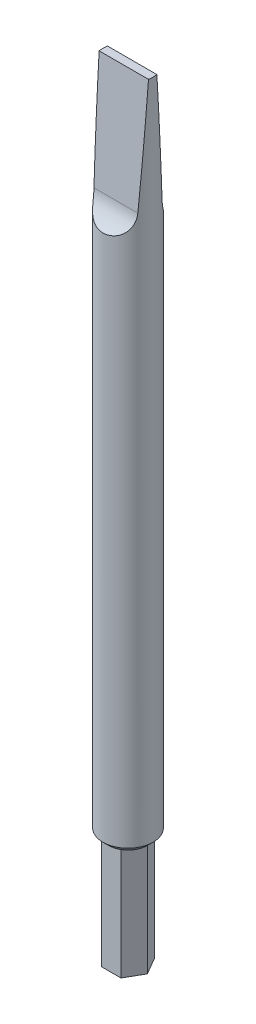
ISO-10303-21;
HEADER;
FILE_DESCRIPTION(('STEP AP214'),'2;1');
FILE_NAME('part.step','',(''),(''),'','','');
FILE_SCHEMA(('AUTOMOTIVE_DESIGN { 1 0 10303 214 1 1 1 1 }'));
ENDSEC;
DATA;
#1=APPLICATION_CONTEXT('core data for automotive mechanical design processes');
#2=APPLICATION_PROTOCOL_DEFINITION('international standard','automotive_design',2000,#1);
#3=PRODUCT_CONTEXT('',#1,'mechanical');
#4=PRODUCT('Part','Part','',(#3));
#5=PRODUCT_RELATED_PRODUCT_CATEGORY('part','',(#4));
#6=PRODUCT_DEFINITION_FORMATION('','',#4);
#7=PRODUCT_DEFINITION_CONTEXT('part definition',#1,'design');
#8=PRODUCT_DEFINITION('design','',#6,#7);
#9=PRODUCT_DEFINITION_SHAPE('','',#8);
#10=(LENGTH_UNIT() NAMED_UNIT(*) SI_UNIT(.MILLI.,.METRE.));
#11=(NAMED_UNIT(*) PLANE_ANGLE_UNIT() SI_UNIT($,.RADIAN.));
#12=(NAMED_UNIT(*) SI_UNIT($,.STERADIAN.) SOLID_ANGLE_UNIT());
#13=UNCERTAINTY_MEASURE_WITH_UNIT(LENGTH_MEASURE(1.E-05),#10,'distance_accuracy_value','');
#14=(GEOMETRIC_REPRESENTATION_CONTEXT(3) GLOBAL_UNCERTAINTY_ASSIGNED_CONTEXT((#13)) GLOBAL_UNIT_ASSIGNED_CONTEXT((#10,
#11,#12)) REPRESENTATION_CONTEXT('',''));
#15=CARTESIAN_POINT('',(0.,0.,0.));
#16=DIRECTION('',(0.,0.,1.));
#17=DIRECTION('',(1.,0.,0.));
#18=AXIS2_PLACEMENT_3D('',#15,#16,#17);
#19=CARTESIAN_POINT('',(0.,140.,0.));
#20=DIRECTION('',(0.,-1.,0.));
#21=DIRECTION('',(0.,0.,-1.));
#22=AXIS2_PLACEMENT_3D('',#19,#20,#21);
#23=CYLINDRICAL_SURFACE('',#22,4.5);
#24=CARTESIAN_POINT('',(0.,21.,0.));
#25=DIRECTION('',(0.,1.,0.));
#26=DIRECTION('',(0.,0.,1.));
#27=AXIS2_PLACEMENT_3D('',#24,#25,#26);
#28=CIRCLE('',#27,4.5);
#29=CARTESIAN_POINT('',(0.,21.,4.5));
#30=VERTEX_POINT('',#29);
#31=EDGE_CURVE('E120',#30,#30,#28,.T.);
#32=ORIENTED_EDGE('',*,*,#31,.T.);
#33=EDGE_LOOP('',(#32));
#34=FACE_BOUND('',#33,.T.);
#35=CARTESIAN_POINT('',(0.,150.725499692534,0.));
#36=DIRECTION('',(0.,-0.0697564737441255,0.997564050259824));
#37=DIRECTION('',(0.,-0.997564050259824,-0.0697564737441255));
#38=AXIS2_PLACEMENT_3D('',#35,#36,#37);
#39=ELLIPSE('',#38,64.5101416179164,4.5);
#40=CARTESIAN_POINT('',(-4.43705983732471,140.,-0.75));
#41=VERTEX_POINT('',#40);
#42=CARTESIAN_POINT('',(-3.94060843870063,119.651217631279,-2.17292547797695));
#43=VERTEX_POINT('',#42);
#44=EDGE_CURVE('E117',#41,#43,#39,.T.);
#45=ORIENTED_EDGE('',*,*,#44,.T.);
#46=CARTESIAN_POINT('',(-3.94060843870063,119.651217631279,-2.17292547797695));
#47=CARTESIAN_POINT('',(-3.93613453836127,119.535820622681,-2.18097697918259));
#48=CARTESIAN_POINT('',(-3.92947094474121,119.420781980209,-2.19306262577348));
#49=CARTESIAN_POINT('',(-3.91143990386196,119.192142075211,-2.22509503569858));
#50=CARTESIAN_POINT('',(-3.90007100119166,119.078541268641,-2.24504423123616));
#51=CARTESIAN_POINT('',(-3.87225058788964,118.853110956475,-2.29268834893347));
#52=CARTESIAN_POINT('',(-3.85577852224869,118.741290572735,-2.32041455254768));
#53=CARTESIAN_POINT('',(-3.81728624165493,118.520713395312,-2.38320927692897));
#54=CARTESIAN_POINT('',(-3.7952665438402,118.411956317124,-2.41827711327371));
#55=CARTESIAN_POINT('',(-3.74503067779342,118.197992726652,-2.49536896839162));
#56=CARTESIAN_POINT('',(-3.71679509883591,118.092798554982,-2.53741467384939));
#57=CARTESIAN_POINT('',(-3.65353870193093,117.887206844789,-2.62767774279539));
#58=CARTESIAN_POINT('',(-3.61851845768965,117.786808901595,-2.6758945843401));
#59=CARTESIAN_POINT('',(-3.54114938762096,117.5919056934,-2.77746734917336));
#60=CARTESIAN_POINT('',(-3.49881744140523,117.497387523424,-2.8308113130091));
#61=CARTESIAN_POINT('',(-3.40621740877894,117.31485041299,-2.94157932893592));
#62=CARTESIAN_POINT('',(-3.35595018710472,117.226830765896,-2.99900293607863));
#63=CARTESIAN_POINT('',(-3.2509131085579,117.06399317642,-3.11241176095055));
#64=CARTESIAN_POINT('',(-3.19670952020653,116.988682062981,-3.16821355425757));
#65=CARTESIAN_POINT('',(-3.08094814297472,116.84482757073,-3.28089601782652));
#66=CARTESIAN_POINT('',(-3.01939113283397,116.776283476681,-3.33777657330996));
#67=CARTESIAN_POINT('',(-2.88897355401037,116.646304005054,-3.45127540230262));
#68=CARTESIAN_POINT('',(-2.82011348473832,116.584868141988,-3.50789369347048));
#69=CARTESIAN_POINT('',(-2.67534804580783,116.469261101259,-3.61951134401522));
#70=CARTESIAN_POINT('',(-2.59944311297892,116.415089473671,-3.67451080349254));
#71=CARTESIAN_POINT('',(-2.44854074393229,116.31876356579,-3.77652535953582));
#72=CARTESIAN_POINT('',(-2.37413558447831,116.275957387855,-3.82380378625174));
#73=CARTESIAN_POINT('',(-2.22035176089097,116.196122204785,-3.91510350311531));
#74=CARTESIAN_POINT('',(-2.1409714916143,116.159095077761,-3.95912373196058));
#75=CARTESIAN_POINT('',(-1.97777084438874,116.090604730084,-4.04312355064205));
#76=CARTESIAN_POINT('',(-1.89394932917378,116.059142943579,-4.08310209783241));
#77=CARTESIAN_POINT('',(-1.72243379944664,116.001505778205,-4.15836458405134));
#78=CARTESIAN_POINT('',(-1.63473840777442,115.975332298059,-4.19364683536832));
#79=CARTESIAN_POINT('',(-1.45498290195123,115.927687019373,-4.25937769280765));
#80=CARTESIAN_POINT('',(-1.36288173901448,115.906278557151,-4.28975985781964));
#81=CARTESIAN_POINT('',(-1.1759495804635,115.868275534781,-4.34472539225634));
#82=CARTESIAN_POINT('',(-1.08111733362925,115.85168322095,-4.36930605478777));
#83=CARTESIAN_POINT('',(-0.889589599589853,115.82308487023,-4.41228344912634));
#84=CARTESIAN_POINT('',(-0.79289819616783,115.811069771572,-4.43069239067199));
#85=CARTESIAN_POINT('',(-0.598088772234085,115.791365663627,-4.46116654062827));
#86=CARTESIAN_POINT('',(-0.499970875992385,115.783676279791,-4.47323229826743));
#87=CARTESIAN_POINT('',(-0.334793464227262,115.774289745482,-4.48802810345971));
#88=CARTESIAN_POINT('',(-0.267948323013006,115.771459023129,-4.49251523740662));
#89=CARTESIAN_POINT('',(-0.13407114126273,115.767687692857,-4.49850140980018));
#90=CARTESIAN_POINT('',(-0.0670390990430205,115.766747102021,-4.50000042124079));
#91=CARTESIAN_POINT('',(0.103899728165749,115.766746479842,-4.4999993471451));
#92=CARTESIAN_POINT('',(0.207816406800852,115.769004812056,-4.49639706128998));
#93=CARTESIAN_POINT('',(0.414992715633222,115.778088182435,-4.48202756678654));
#94=CARTESIAN_POINT('',(0.518252019298791,115.784915334752,-4.47125704115421));
#95=CARTESIAN_POINT('',(0.72354459567443,115.803298078138,-4.44266135596965));
#96=CARTESIAN_POINT('',(0.825575538970318,115.814861528568,-4.42482447219796));
#97=CARTESIAN_POINT('',(1.02756052241239,115.842954372874,-4.38232527899109));
#98=CARTESIAN_POINT('',(1.12751361949297,115.859485971193,-4.35765994004909));
#99=CARTESIAN_POINT('',(1.32469006293437,115.897838871514,-4.30182602120851));
#100=CARTESIAN_POINT('',(1.42190987280691,115.919666703646,-4.27064941973946));
#101=CARTESIAN_POINT('',(1.61270615332902,115.968939005443,-4.2023137913944));
#102=CARTESIAN_POINT('',(1.70628435417008,115.996380768077,-4.16515764968153));
#103=CARTESIAN_POINT('',(1.88905676568278,116.057229964812,-4.0855103376416));
#104=CARTESIAN_POINT('',(1.97825380865808,116.090633478304,-4.0430226788836));
#105=CARTESIAN_POINT('',(2.15162802908161,116.163752699636,-3.9534813076382));
#106=CARTESIAN_POINT('',(2.23580544578817,116.203468106292,-3.90642781306074));
#107=CARTESIAN_POINT('',(2.39605028556675,116.288175405829,-3.81017251378525));
#108=CARTESIAN_POINT('',(2.47228585911362,116.332971722124,-3.76107850575399));
#109=CARTESIAN_POINT('',(2.61898270302838,116.428905771767,-3.66044320005788));
#110=CARTESIAN_POINT('',(2.68944197304487,116.480045686644,-3.60890106427653));
#111=CARTESIAN_POINT('',(2.82415599278799,116.588634634983,-3.50448332513091));
#112=CARTESIAN_POINT('',(2.88841415937435,116.646080156272,-3.45160847659475));
#113=CARTESIAN_POINT('',(3.01058224303269,116.767195132877,-3.34558516850439));
#114=CARTESIAN_POINT('',(3.06848981966071,116.830866866557,-3.29243661558388));
#115=CARTESIAN_POINT('',(3.17574329962985,116.961540598027,-3.18904171265143));
#116=CARTESIAN_POINT('',(3.22533513488353,117.02831565721,-3.13876304771544));
#117=CARTESIAN_POINT('',(3.31869480646398,117.167024542179,-3.03988341659307));
#118=CARTESIAN_POINT('',(3.36246057537569,117.238960185368,-2.99128305046797));
#119=CARTESIAN_POINT('',(3.44435200258204,117.387545271136,-2.89661152472469));
#120=CARTESIAN_POINT('',(3.48247761883404,117.464194748846,-2.8505403839614));
#121=CARTESIAN_POINT('',(3.5533922834407,117.621759266709,-2.76163697617394));
#122=CARTESIAN_POINT('',(3.58617934656772,117.702675878924,-2.71880591718233));
#123=CARTESIAN_POINT('',(3.64844684895386,117.872898609567,-2.63471555664882));
#124=CARTESIAN_POINT('',(3.67763825368493,117.962420683473,-2.59367954418584));
#125=CARTESIAN_POINT('',(3.73087847262744,118.145069383353,-2.51649461313893));
#126=CARTESIAN_POINT('',(3.75492510540121,118.238197518649,-2.48034776999426));
#127=CARTESIAN_POINT('',(3.79828256501097,118.427405808864,-2.41342928729884));
#128=CARTESIAN_POINT('',(3.8175946756726,118.523485155555,-2.38265619124115));
#129=CARTESIAN_POINT('',(3.85188091079617,118.718051853066,-2.32681768893628));
#130=CARTESIAN_POINT('',(3.86685449345663,118.816539502973,-2.30175299564602));
#131=CARTESIAN_POINT('',(3.89557075715267,119.036560045232,-2.25289241108845));
#132=CARTESIAN_POINT('',(3.90837111115832,119.158531278134,-2.23050520402001));
#133=CARTESIAN_POINT('',(3.92848003713233,119.403943849301,-2.19484953417759));
#134=CARTESIAN_POINT('',(3.935801859481,119.527380902223,-2.18155907668645));
#135=CARTESIAN_POINT('',(3.94060843870063,119.651217631279,-2.17292547797695));
#136=B_SPLINE_CURVE_WITH_KNOTS('',3,(#46,#47,#48,#49,#50,#51,#52,#53,#54,#55,#56,#57,#58,#59,
#60,#61,#62,#63,#64,#65,#66,#67,#68,#69,#70,#71,#72,#73,#74,#75,#76,#77,#78,#79,#80,#81,#82,#83,
#84,#85,#86,#87,#88,#89,#90,#91,#92,#93,#94,#95,#96,#97,#98,#99,#100,#101,#102,#103,#104,#105,
#106,#107,#108,#109,#110,#111,#112,#113,#114,#115,#116,#117,#118,#119,#120,#121,#122,#123,#124,
#125,#126,#127,#128,#129,#130,#131,#132,#133,#134,#135),.UNSPECIFIED.,.F.,.F.,(4,2,2,2,2,2,2,2,
2,2,2,2,2,2,2,2,2,2,2,2,2,2,2,2,2,2,2,2,2,2,2,2,2,2,2,2,2,2,2,2,2,2,2,2,4),(0.,
0.347213481850569,0.694534441545247,1.04327297331349,1.39197900846225,1.74178981927731,
2.0915710632544,2.44055534800831,2.78950162887225,3.11387755351365,3.43821915660431,
3.76253859427388,4.0868379353466,4.38048652057452,4.67423033967266,4.96804974448696,
5.26197445596483,5.55959931971795,5.85736277740991,6.15453363404642,6.45167875571976,
6.65275701811362,6.85383709780357,7.16547860130776,7.47726441210352,7.78956970663768,
8.10201378094383,8.41484506654002,8.72752585929502,9.0400017773417,9.35246278943322,
9.65548728912213,9.95861628768749,10.2615772943742,10.5646495816183,10.8558942484657,
11.1472419913091,11.4385919057976,11.7300499172571,12.0378731212137,12.3458265879224,
12.6536964565557,12.9616047558561,13.3351302308025,13.7077493504199),.UNSPECIFIED.);
#137=CARTESIAN_POINT('',(3.94060843870063,119.651217631279,-2.17292547797695));
#138=VERTEX_POINT('',#137);
#139=EDGE_CURVE('E12',#43,#138,#136,.T.);
#140=ORIENTED_EDGE('',*,*,#139,.T.);
#141=CARTESIAN_POINT('',(4.43705983732471,140.,-0.75));
#142=VERTEX_POINT('',#141);
#143=EDGE_CURVE('E82',#138,#142,#39,.T.);
#144=ORIENTED_EDGE('',*,*,#143,.T.);
#145=CARTESIAN_POINT('',(0.,140.,0.));
#146=DIRECTION('',(0.,1.,0.));
#147=DIRECTION('',(0.,0.,1.));
#148=AXIS2_PLACEMENT_3D('',#145,#146,#147);
#149=CIRCLE('',#148,4.5);
#150=CARTESIAN_POINT('',(4.43705983732471,140.,0.75));
#151=VERTEX_POINT('',#150);
#152=EDGE_CURVE('E114',#151,#142,#149,.T.);
#153=ORIENTED_EDGE('',*,*,#152,.F.);
#154=CARTESIAN_POINT('',(0.,150.725499692534,0.));
#155=DIRECTION('',(0.,-0.0697564737441255,-0.997564050259824));
#156=DIRECTION('',(0.,-0.997564050259824,0.0697564737441255));
#157=AXIS2_PLACEMENT_3D('',#154,#155,#156);
#158=ELLIPSE('',#157,64.5101416179164,4.5);
#159=CARTESIAN_POINT('',(3.94060843870063,119.651217631279,2.17292547797695));
#160=VERTEX_POINT('',#159);
#161=EDGE_CURVE('E101',#160,#151,#158,.F.);
#162=ORIENTED_EDGE('',*,*,#161,.F.);
#163=CARTESIAN_POINT('',(3.94060843870063,119.651217631279,2.17292547797695));
#164=CARTESIAN_POINT('',(3.93613453836127,119.535820622681,2.18097697918259));
#165=CARTESIAN_POINT('',(3.92947094474121,119.420781980209,2.19306262577348));
#166=CARTESIAN_POINT('',(3.91143990386196,119.192142075211,2.22509503569858));
#167=CARTESIAN_POINT('',(3.90007100119166,119.078541268641,2.24504423123616));
#168=CARTESIAN_POINT('',(3.87225058788964,118.853110956475,2.29268834893347));
#169=CARTESIAN_POINT('',(3.85577852224869,118.741290572735,2.32041455254768));
#170=CARTESIAN_POINT('',(3.81728624165493,118.520713395312,2.38320927692897));
#171=CARTESIAN_POINT('',(3.7952665438402,118.411956317124,2.41827711327371));
#172=CARTESIAN_POINT('',(3.74503067779342,118.197992726652,2.49536896839162));
#173=CARTESIAN_POINT('',(3.71679509883591,118.092798554982,2.53741467384939));
#174=CARTESIAN_POINT('',(3.65353870193093,117.887206844789,2.62767774279539));
#175=CARTESIAN_POINT('',(3.61851845768965,117.786808901595,2.6758945843401));
#176=CARTESIAN_POINT('',(3.54114938762096,117.5919056934,2.77746734917336));
#177=CARTESIAN_POINT('',(3.49881744140523,117.497387523424,2.8308113130091));
#178=CARTESIAN_POINT('',(3.40621740877894,117.31485041299,2.94157932893592));
#179=CARTESIAN_POINT('',(3.35595018710472,117.226830765896,2.99900293607863));
#180=CARTESIAN_POINT('',(3.2509131085579,117.06399317642,3.11241176095055));
#181=CARTESIAN_POINT('',(3.19670952020653,116.988682062981,3.16821355425757));
#182=CARTESIAN_POINT('',(3.08094814297472,116.84482757073,3.28089601782652));
#183=CARTESIAN_POINT('',(3.01939113283397,116.776283476681,3.33777657330996));
#184=CARTESIAN_POINT('',(2.88897355401037,116.646304005054,3.45127540230262));
#185=CARTESIAN_POINT('',(2.82011348473832,116.584868141988,3.50789369347048));
#186=CARTESIAN_POINT('',(2.67534804580783,116.469261101259,3.61951134401522));
#187=CARTESIAN_POINT('',(2.59944311297892,116.415089473671,3.67451080349254));
#188=CARTESIAN_POINT('',(2.44854074393229,116.31876356579,3.77652535953582));
#189=CARTESIAN_POINT('',(2.37413558447831,116.275957387855,3.82380378625174));
#190=CARTESIAN_POINT('',(2.22035176089097,116.196122204785,3.91510350311531));
#191=CARTESIAN_POINT('',(2.1409714916143,116.159095077761,3.95912373196058));
#192=CARTESIAN_POINT('',(1.97777084438874,116.090604730084,4.04312355064205));
#193=CARTESIAN_POINT('',(1.89394932917378,116.059142943579,4.08310209783241));
#194=CARTESIAN_POINT('',(1.72243379944664,116.001505778205,4.15836458405134));
#195=CARTESIAN_POINT('',(1.63473840777442,115.975332298059,4.19364683536832));
#196=CARTESIAN_POINT('',(1.45498290195123,115.927687019373,4.25937769280765));
#197=CARTESIAN_POINT('',(1.36288173901448,115.906278557151,4.28975985781964));
#198=CARTESIAN_POINT('',(1.1759495804635,115.868275534781,4.34472539225634));
#199=CARTESIAN_POINT('',(1.08111733362925,115.85168322095,4.36930605478777));
#200=CARTESIAN_POINT('',(0.889589599589853,115.82308487023,4.41228344912634));
#201=CARTESIAN_POINT('',(0.792898196167831,115.811069771572,4.43069239067199));
#202=CARTESIAN_POINT('',(0.598088772234086,115.791365663627,4.46116654062827));
#203=CARTESIAN_POINT('',(0.499970875992386,115.783676279791,4.47323229826743));
#204=CARTESIAN_POINT('',(0.334793464227262,115.774289745482,4.48802810345971));
#205=CARTESIAN_POINT('',(0.267948323013005,115.771459023129,4.49251523740662));
#206=CARTESIAN_POINT('',(0.13407114126273,115.767687692857,4.49850140980018));
#207=CARTESIAN_POINT('',(0.0670390990430208,115.766747102021,4.50000042124079));
#208=CARTESIAN_POINT('',(-0.103899728165748,115.766746479842,4.4999993471451));
#209=CARTESIAN_POINT('',(-0.207816406800851,115.769004812056,4.49639706128998));
#210=CARTESIAN_POINT('',(-0.414992715633221,115.778088182435,4.48202756678654));
#211=CARTESIAN_POINT('',(-0.518252019298789,115.784915334752,4.47125704115421));
#212=CARTESIAN_POINT('',(-0.723544595674428,115.803298078138,4.44266135596965));
#213=CARTESIAN_POINT('',(-0.825575538970317,115.814861528568,4.42482447219796));
#214=CARTESIAN_POINT('',(-1.02756052241239,115.842954372874,4.38232527899109));
#215=CARTESIAN_POINT('',(-1.12751361949297,115.859485971193,4.35765994004909));
#216=CARTESIAN_POINT('',(-1.32469006293437,115.897838871514,4.30182602120851));
#217=CARTESIAN_POINT('',(-1.42190987280691,115.919666703646,4.27064941973946));
#218=CARTESIAN_POINT('',(-1.61270615332902,115.968939005443,4.2023137913944));
#219=CARTESIAN_POINT('',(-1.70628435417008,115.996380768077,4.16515764968153));
#220=CARTESIAN_POINT('',(-1.88905676568278,116.057229964812,4.0855103376416));
#221=CARTESIAN_POINT('',(-1.97825380865808,116.090633478304,4.0430226788836));
#222=CARTESIAN_POINT('',(-2.15162802908161,116.163752699636,3.9534813076382));
#223=CARTESIAN_POINT('',(-2.23580544578817,116.203468106292,3.90642781306073));
#224=CARTESIAN_POINT('',(-2.39605028556674,116.288175405829,3.81017251378525));
#225=CARTESIAN_POINT('',(-2.47228585911361,116.332971722124,3.761078505754));
#226=CARTESIAN_POINT('',(-2.61898270302836,116.428905771767,3.66044320005789));
#227=CARTESIAN_POINT('',(-2.68944197304486,116.480045686644,3.60890106427654));
#228=CARTESIAN_POINT('',(-2.82415599278797,116.588634634983,3.50448332513092));
#229=CARTESIAN_POINT('',(-2.88841415937433,116.646080156272,3.45160847659476));
#230=CARTESIAN_POINT('',(-3.01058224303268,116.767195132877,3.34558516850441));
#231=CARTESIAN_POINT('',(-3.0684898196607,116.830866866557,3.29243661558389));
#232=CARTESIAN_POINT('',(-3.17574329962984,116.961540598027,3.18904171265143));
#233=CARTESIAN_POINT('',(-3.22533513488353,117.02831565721,3.13876304771544));
#234=CARTESIAN_POINT('',(-3.31869480646398,117.167024542179,3.03988341659307));
#235=CARTESIAN_POINT('',(-3.3624605753757,117.238960185368,2.99128305046797));
#236=CARTESIAN_POINT('',(-3.44435200258205,117.387545271136,2.89661152472469));
#237=CARTESIAN_POINT('',(-3.48247761883404,117.464194748846,2.8505403839614));
#238=CARTESIAN_POINT('',(-3.55339228344069,117.621759266709,2.76163697617393));
#239=CARTESIAN_POINT('',(-3.58617934656772,117.702675878924,2.71880591718232));
#240=CARTESIAN_POINT('',(-3.64844684895386,117.872898609567,2.63471555664882));
#241=CARTESIAN_POINT('',(-3.67763825368493,117.962420683473,2.59367954418584));
#242=CARTESIAN_POINT('',(-3.73087847262744,118.145069383353,2.51649461313893));
#243=CARTESIAN_POINT('',(-3.75492510540121,118.238197518649,2.48034776999426));
#244=CARTESIAN_POINT('',(-3.79828256501097,118.427405808864,2.41342928729884));
#245=CARTESIAN_POINT('',(-3.8175946756726,118.523485155555,2.38265619124115));
#246=CARTESIAN_POINT('',(-3.85188091079617,118.718051853066,2.32681768893628));
#247=CARTESIAN_POINT('',(-3.86685449345663,118.816539502973,2.30175299564602));
#248=CARTESIAN_POINT('',(-3.89557075715267,119.036560045232,2.25289241108845));
#249=CARTESIAN_POINT('',(-3.90837111115832,119.158531278134,2.23050520402001));
#250=CARTESIAN_POINT('',(-3.92848003713233,119.403943849301,2.19484953417759));
#251=CARTESIAN_POINT('',(-3.935801859481,119.527380902223,2.18155907668645));
#252=CARTESIAN_POINT('',(-3.94060843870063,119.651217631279,2.17292547797695));
#253=B_SPLINE_CURVE_WITH_KNOTS('',3,(#163,#164,#165,#166,#167,#168,#169,#170,#171,#172,#173,
#174,#175,#176,#177,#178,#179,#180,#181,#182,#183,#184,#185,#186,#187,#188,#189,#190,#191,#192,
#193,#194,#195,#196,#197,#198,#199,#200,#201,#202,#203,#204,#205,#206,#207,#208,#209,#210,#211,
#212,#213,#214,#215,#216,#217,#218,#219,#220,#221,#222,#223,#224,#225,#226,#227,#228,#229,#230,
#231,#232,#233,#234,#235,#236,#237,#238,#239,#240,#241,#242,#243,#244,#245,#246,#247,#248,#249,
#250,#251,#252),.UNSPECIFIED.,.F.,.F.,(4,2,2,2,2,2,2,2,2,2,2,2,2,2,2,2,2,2,2,2,2,2,2,2,2,2,2,2,
2,2,2,2,2,2,2,2,2,2,2,2,2,2,2,2,4),(0.,0.347213481850569,0.694534441545247,1.04327297331349,
1.39197900846225,1.74178981927731,2.0915710632544,2.44055534800831,2.78950162887225,
3.11387755351365,3.43821915660431,3.76253859427388,4.0868379353466,4.38048652057452,
4.67423033967267,4.96804974448696,5.26197445596484,5.55959931971795,5.85736277740991,
6.15453363404642,6.45167875571976,6.65275701811362,6.85383709780357,7.16547860130776,
7.47726441210352,7.78956970663768,8.10201378094383,8.41484506654002,8.72752585929502,
9.0400017773417,9.35246278943322,9.65548728912213,9.95861628768747,10.2615772943742,
10.5646495816183,10.8558942484657,11.1472419913092,11.4385919057976,11.7300499172571,
12.0378731212137,12.3458265879224,12.6536964565557,12.9616047558561,13.3351302308025,
13.7077493504199),.UNSPECIFIED.);
#254=CARTESIAN_POINT('',(-3.94060843870063,119.651217631279,2.17292547797695));
#255=VERTEX_POINT('',#254);
#256=EDGE_CURVE('E67',#160,#255,#253,.T.);
#257=ORIENTED_EDGE('',*,*,#256,.T.);
#258=CARTESIAN_POINT('',(-4.43705983732471,140.,0.75));
#259=VERTEX_POINT('',#258);
#260=EDGE_CURVE('E103',#259,#255,#158,.F.);
#261=ORIENTED_EDGE('',*,*,#260,.F.);
#262=EDGE_CURVE('E111',#41,#259,#149,.T.);
#263=ORIENTED_EDGE('',*,*,#262,.F.);
#264=EDGE_LOOP('',(#45,#140,#144,#153,#162,#257,#261,#263));
#265=FACE_BOUND('',#264,.T.);
#266=ADVANCED_FACE('F51',(#34,#265),#23,.T.);
#267=CARTESIAN_POINT('',(0.,140.,0.));
#268=DIRECTION('',(0.,1.,0.));
#269=DIRECTION('',(0.,0.,1.));
#270=AXIS2_PLACEMENT_3D('',#267,#268,#269);
#271=PLANE('',#270);
#272=DIRECTION('',(1.,0.,0.));
#273=VECTOR('',#272,1.);
#274=CARTESIAN_POINT('',(0.,140.,-0.75));
#275=LINE('',#274,#273);
#276=EDGE_CURVE('E110',#41,#142,#275,.T.);
#277=ORIENTED_EDGE('',*,*,#276,.F.);
#278=ORIENTED_EDGE('',*,*,#262,.T.);
#279=DIRECTION('',(1.,0.,0.));
#280=VECTOR('',#279,1.);
#281=CARTESIAN_POINT('',(0.,140.,0.75));
#282=LINE('',#281,#280);
#283=EDGE_CURVE('E96',#259,#151,#282,.T.);
#284=ORIENTED_EDGE('',*,*,#283,.T.);
#285=ORIENTED_EDGE('',*,*,#152,.T.);
#286=EDGE_LOOP('',(#277,#278,#284,#285));
#287=FACE_BOUND('',#286,.T.);
#288=ADVANCED_FACE('F112',(#287),#271,.T.);
#289=CARTESIAN_POINT('',(0.,20.,0.));
#290=DIRECTION('',(0.,1.,0.));
#291=DIRECTION('',(0.,0.,1.));
#292=AXIS2_PLACEMENT_3D('',#289,#290,#291);
#293=PLANE('',#292);
#294=CARTESIAN_POINT('',(0.,20.,0.));
#295=DIRECTION('',(0.,1.,0.));
#296=DIRECTION('',(0.,0.,1.));
#297=AXIS2_PLACEMENT_3D('',#294,#295,#296);
#298=CIRCLE('',#297,3.5);
#299=CARTESIAN_POINT('',(0.,20.,3.5));
#300=VERTEX_POINT('',#299);
#301=EDGE_CURVE('E108',#300,#300,#298,.F.);
#302=ORIENTED_EDGE('',*,*,#301,.T.);
#303=EDGE_LOOP('',(#302));
#304=FACE_BOUND('',#303,.T.);
#305=ADVANCED_FACE('F143',(#304),#293,.F.);
#306=CARTESIAN_POINT('',(0.,21.,0.));
#307=DIRECTION('',(0.,1.,0.));
#308=DIRECTION('',(0.,0.,1.));
#309=AXIS2_PLACEMENT_3D('',#306,#307,#308);
#310=CONICAL_SURFACE('',#309,4.5,0.785398163397453);
#311=ORIENTED_EDGE('',*,*,#301,.F.);
#312=EDGE_LOOP('',(#311));
#313=FACE_BOUND('',#312,.T.);
#314=ORIENTED_EDGE('',*,*,#31,.F.);
#315=EDGE_LOOP('',(#314));
#316=FACE_BOUND('',#315,.T.);
#317=ADVANCED_FACE('F142',(#313,#316),#310,.T.);
#318=CARTESIAN_POINT('',(0.,140.,0.75));
#319=DIRECTION('',(0.,-0.0697564737441255,-0.997564050259824));
#320=DIRECTION('',(0.,-0.997564050259824,0.0697564737441255));
#321=AXIS2_PLACEMENT_3D('',#318,#319,#320);
#322=PLANE('',#321);
#323=ORIENTED_EDGE('',*,*,#260,.T.);
#324=DIRECTION('',(1.,0.,0.));
#325=VECTOR('',#324,1.);
#326=CARTESIAN_POINT('',(3.74287926057653,119.651217631279,2.17292547797695));
#327=LINE('',#326,#325);
#328=EDGE_CURVE('E123',#255,#160,#327,.T.);
#329=ORIENTED_EDGE('',*,*,#328,.T.);
#330=ORIENTED_EDGE('',*,*,#161,.T.);
#331=ORIENTED_EDGE('',*,*,#283,.F.);
#332=EDGE_LOOP('',(#323,#329,#330,#331));
#333=FACE_BOUND('',#332,.T.);
#334=ADVANCED_FACE('F99',(#333),#322,.F.);
#335=CARTESIAN_POINT('',(0.,140.,-0.75));
#336=DIRECTION('',(0.,-0.0697564737441255,0.997564050259824));
#337=DIRECTION('',(0.,-0.997564050259824,-0.0697564737441255));
#338=AXIS2_PLACEMENT_3D('',#335,#336,#337);
#339=PLANE('',#338);
#340=ORIENTED_EDGE('',*,*,#143,.F.);
#341=DIRECTION('',(1.,0.,0.));
#342=VECTOR('',#341,1.);
#343=CARTESIAN_POINT('',(0.,119.651217631279,-2.17292547797695));
#344=LINE('',#343,#342);
#345=EDGE_CURVE('E126',#138,#43,#344,.F.);
#346=ORIENTED_EDGE('',*,*,#345,.T.);
#347=ORIENTED_EDGE('',*,*,#44,.F.);
#348=ORIENTED_EDGE('',*,*,#276,.T.);
#349=EDGE_LOOP('',(#340,#346,#347,#348));
#350=FACE_BOUND('',#349,.T.);
#351=ADVANCED_FACE('F139',(#350),#339,.F.);
#352=CARTESIAN_POINT('',(0.,120.,7.16074572927607));
#353=DIRECTION('',(1.,0.,0.));
#354=DIRECTION('',(0.,0.,-1.));
#355=AXIS2_PLACEMENT_3D('',#352,#353,#354);
#356=CYLINDRICAL_SURFACE('',#355,5.);
#357=ORIENTED_EDGE('',*,*,#328,.F.);
#358=ORIENTED_EDGE('',*,*,#256,.F.);
#359=EDGE_LOOP('',(#357,#358));
#360=FACE_BOUND('',#359,.T.);
#361=ADVANCED_FACE('F137',(#360),#356,.F.);
#362=CARTESIAN_POINT('',(0.,120.,-7.16074572927607));
#363=DIRECTION('',(1.,0.,0.));
#364=DIRECTION('',(0.,0.,-1.));
#365=AXIS2_PLACEMENT_3D('',#362,#363,#364);
#366=CYLINDRICAL_SURFACE('',#365,5.);
#367=ORIENTED_EDGE('',*,*,#139,.F.);
#368=ORIENTED_EDGE('',*,*,#345,.F.);
#369=EDGE_LOOP('',(#367,#368));
#370=FACE_BOUND('',#369,.T.);
#371=ADVANCED_FACE('F52',(#370),#366,.F.);
#372=CLOSED_SHELL('',(#266,#288,#305,#317,#334,#351,#361,#371));
#373=MANIFOLD_SOLID_BREP('B2',#372);
#374=CARTESIAN_POINT('',(1.73205080756889,20.,3.));
#375=DIRECTION('',(-0.866025403784439,0.,-0.5));
#376=DIRECTION('',(-0.5,0.,0.866025403784439));
#377=AXIS2_PLACEMENT_3D('',#374,#375,#376);
#378=PLANE('',#377);
#379=DIRECTION('',(0.5,0.,-0.866025403784439));
#380=VECTOR('',#379,1.);
#381=CARTESIAN_POINT('',(1.73205080756889,0.,3.));
#382=LINE('',#381,#380);
#383=CARTESIAN_POINT('',(1.73205080756889,0.,3.));
#384=VERTEX_POINT('',#383);
#385=CARTESIAN_POINT('',(3.46410161513777,0.,0.));
#386=VERTEX_POINT('',#385);
#387=EDGE_CURVE('E310',#384,#386,#382,.T.);
#388=ORIENTED_EDGE('',*,*,#387,.T.);
#389=DIRECTION('',(0.,-1.,0.));
#390=VECTOR('',#389,1.);
#391=CARTESIAN_POINT('',(3.46410161513777,20.,0.));
#392=LINE('',#391,#390);
#393=CARTESIAN_POINT('',(3.46410161513777,20.,0.));
#394=VERTEX_POINT('',#393);
#395=EDGE_CURVE('E47',#394,#386,#392,.T.);
#396=ORIENTED_EDGE('',*,*,#395,.F.);
#397=DIRECTION('',(0.5,0.,-0.866025403784439));
#398=VECTOR('',#397,1.);
#399=CARTESIAN_POINT('',(1.73205080756889,20.,3.));
#400=LINE('',#399,#398);
#401=CARTESIAN_POINT('',(1.73205080756889,20.,3.));
#402=VERTEX_POINT('',#401);
#403=EDGE_CURVE('E320',#402,#394,#400,.T.);
#404=ORIENTED_EDGE('',*,*,#403,.F.);
#405=DIRECTION('',(0.,-1.,0.));
#406=VECTOR('',#405,1.);
#407=CARTESIAN_POINT('',(1.73205080756889,20.,3.));
#408=LINE('',#407,#406);
#409=EDGE_CURVE('E303',#402,#384,#408,.T.);
#410=ORIENTED_EDGE('',*,*,#409,.T.);
#411=EDGE_LOOP('',(#388,#396,#404,#410));
#412=FACE_BOUND('',#411,.T.);
#413=ADVANCED_FACE('F223',(#412),#378,.F.);
#414=CARTESIAN_POINT('',(3.46410161513777,20.,0.));
#415=DIRECTION('',(-0.866025403784438,0.,0.500000000000002));
#416=DIRECTION('',(0.500000000000002,0.,0.866025403784438));
#417=AXIS2_PLACEMENT_3D('',#414,#415,#416);
#418=PLANE('',#417);
#419=DIRECTION('',(-0.500000000000002,0.,-0.866025403784438));
#420=VECTOR('',#419,1.);
#421=CARTESIAN_POINT('',(3.46410161513777,0.,0.));
#422=LINE('',#421,#420);
#423=CARTESIAN_POINT('',(1.73205080756888,0.,-3.));
#424=VERTEX_POINT('',#423);
#425=EDGE_CURVE('E309',#386,#424,#422,.T.);
#426=ORIENTED_EDGE('',*,*,#425,.T.);
#427=DIRECTION('',(0.,-1.,0.));
#428=VECTOR('',#427,1.);
#429=CARTESIAN_POINT('',(1.73205080756888,20.,-3.));
#430=LINE('',#429,#428);
#431=CARTESIAN_POINT('',(1.73205080756888,20.,-3.));
#432=VERTEX_POINT('',#431);
#433=EDGE_CURVE('E233',#432,#424,#430,.T.);
#434=ORIENTED_EDGE('',*,*,#433,.F.);
#435=DIRECTION('',(-0.500000000000002,0.,-0.866025403784438));
#436=VECTOR('',#435,1.);
#437=CARTESIAN_POINT('',(3.46410161513777,20.,0.));
#438=LINE('',#437,#436);
#439=EDGE_CURVE('E279',#394,#432,#438,.T.);
#440=ORIENTED_EDGE('',*,*,#439,.F.);
#441=ORIENTED_EDGE('',*,*,#395,.T.);
#442=EDGE_LOOP('',(#426,#434,#440,#441));
#443=FACE_BOUND('',#442,.T.);
#444=ADVANCED_FACE('F344',(#443),#418,.F.);
#445=CARTESIAN_POINT('',(1.73205080756888,20.,-3.));
#446=DIRECTION('',(0.,0.,1.));
#447=DIRECTION('',(1.,0.,0.));
#448=AXIS2_PLACEMENT_3D('',#445,#446,#447);
#449=PLANE('',#448);
#450=DIRECTION('',(-1.,0.,0.));
#451=VECTOR('',#450,1.);
#452=CARTESIAN_POINT('',(1.73205080756888,0.,-3.));
#453=LINE('',#452,#451);
#454=CARTESIAN_POINT('',(-1.73205080756888,0.,-3.));
#455=VERTEX_POINT('',#454);
#456=EDGE_CURVE('E315',#424,#455,#453,.T.);
#457=ORIENTED_EDGE('',*,*,#456,.T.);
#458=DIRECTION('',(0.,-1.,0.));
#459=VECTOR('',#458,1.);
#460=CARTESIAN_POINT('',(-1.73205080756888,20.,-3.));
#461=LINE('',#460,#459);
#462=CARTESIAN_POINT('',(-1.73205080756888,20.,-3.));
#463=VERTEX_POINT('',#462);
#464=EDGE_CURVE('E296',#463,#455,#461,.T.);
#465=ORIENTED_EDGE('',*,*,#464,.F.);
#466=DIRECTION('',(-1.,0.,0.));
#467=VECTOR('',#466,1.);
#468=CARTESIAN_POINT('',(1.73205080756888,20.,-3.));
#469=LINE('',#468,#467);
#470=EDGE_CURVE('E289',#432,#463,#469,.T.);
#471=ORIENTED_EDGE('',*,*,#470,.F.);
#472=ORIENTED_EDGE('',*,*,#433,.T.);
#473=EDGE_LOOP('',(#457,#465,#471,#472));
#474=FACE_BOUND('',#473,.T.);
#475=ADVANCED_FACE('F325',(#474),#449,.F.);
#476=CARTESIAN_POINT('',(-1.73205080756888,20.,-3.));
#477=DIRECTION('',(0.866025403784439,0.,0.5));
#478=DIRECTION('',(0.5,0.,-0.866025403784439));
#479=AXIS2_PLACEMENT_3D('',#476,#477,#478);
#480=PLANE('',#479);
#481=DIRECTION('',(-0.5,0.,0.866025403784439));
#482=VECTOR('',#481,1.);
#483=CARTESIAN_POINT('',(-1.73205080756888,0.,-3.));
#484=LINE('',#483,#482);
#485=CARTESIAN_POINT('',(-3.46410161513775,0.,0.));
#486=VERTEX_POINT('',#485);
#487=EDGE_CURVE('E300',#455,#486,#484,.T.);
#488=ORIENTED_EDGE('',*,*,#487,.T.);
#489=DIRECTION('',(0.,-1.,0.));
#490=VECTOR('',#489,1.);
#491=CARTESIAN_POINT('',(-3.46410161513775,20.,0.));
#492=LINE('',#491,#490);
#493=CARTESIAN_POINT('',(-3.46410161513775,20.,0.));
#494=VERTEX_POINT('',#493);
#495=EDGE_CURVE('E295',#494,#486,#492,.T.);
#496=ORIENTED_EDGE('',*,*,#495,.F.);
#497=DIRECTION('',(-0.5,0.,0.866025403784439));
#498=VECTOR('',#497,1.);
#499=CARTESIAN_POINT('',(-1.73205080756888,20.,-3.));
#500=LINE('',#499,#498);
#501=EDGE_CURVE('E285',#463,#494,#500,.T.);
#502=ORIENTED_EDGE('',*,*,#501,.F.);
#503=ORIENTED_EDGE('',*,*,#464,.T.);
#504=EDGE_LOOP('',(#488,#496,#502,#503));
#505=FACE_BOUND('',#504,.T.);
#506=ADVANCED_FACE('F294',(#505),#480,.F.);
#507=CARTESIAN_POINT('',(-3.46410161513775,20.,0.));
#508=DIRECTION('',(0.866025403784439,0.,-0.5));
#509=DIRECTION('',(-0.5,0.,-0.866025403784439));
#510=AXIS2_PLACEMENT_3D('',#507,#508,#509);
#511=PLANE('',#510);
#512=DIRECTION('',(0.5,0.,0.866025403784439));
#513=VECTOR('',#512,1.);
#514=CARTESIAN_POINT('',(-3.46410161513775,0.,0.));
#515=LINE('',#514,#513);
#516=CARTESIAN_POINT('',(-1.73205080756888,0.,3.));
#517=VERTEX_POINT('',#516);
#518=EDGE_CURVE('E264',#486,#517,#515,.T.);
#519=ORIENTED_EDGE('',*,*,#518,.T.);
#520=DIRECTION('',(0.,-1.,0.));
#521=VECTOR('',#520,1.);
#522=CARTESIAN_POINT('',(-1.73205080756888,20.,3.));
#523=LINE('',#522,#521);
#524=CARTESIAN_POINT('',(-1.73205080756888,20.,3.));
#525=VERTEX_POINT('',#524);
#526=EDGE_CURVE('E299',#525,#517,#523,.T.);
#527=ORIENTED_EDGE('',*,*,#526,.F.);
#528=DIRECTION('',(0.5,0.,0.866025403784439));
#529=VECTOR('',#528,1.);
#530=CARTESIAN_POINT('',(-3.46410161513775,20.,0.));
#531=LINE('',#530,#529);
#532=EDGE_CURVE('E290',#494,#525,#531,.T.);
#533=ORIENTED_EDGE('',*,*,#532,.F.);
#534=ORIENTED_EDGE('',*,*,#495,.T.);
#535=EDGE_LOOP('',(#519,#527,#533,#534));
#536=FACE_BOUND('',#535,.T.);
#537=ADVANCED_FACE('F301',(#536),#511,.F.);
#538=CARTESIAN_POINT('',(-1.73205080756888,20.,3.));
#539=DIRECTION('',(0.,0.,-1.));
#540=DIRECTION('',(-1.,0.,0.));
#541=AXIS2_PLACEMENT_3D('',#538,#539,#540);
#542=PLANE('',#541);
#543=DIRECTION('',(1.,0.,0.));
#544=VECTOR('',#543,1.);
#545=CARTESIAN_POINT('',(-1.73205080756888,0.,3.));
#546=LINE('',#545,#544);
#547=EDGE_CURVE('E268',#517,#384,#546,.T.);
#548=ORIENTED_EDGE('',*,*,#547,.T.);
#549=ORIENTED_EDGE('',*,*,#409,.F.);
#550=DIRECTION('',(1.,0.,0.));
#551=VECTOR('',#550,1.);
#552=CARTESIAN_POINT('',(-1.73205080756888,20.,3.));
#553=LINE('',#552,#551);
#554=EDGE_CURVE('E237',#525,#402,#553,.T.);
#555=ORIENTED_EDGE('',*,*,#554,.F.);
#556=ORIENTED_EDGE('',*,*,#526,.T.);
#557=EDGE_LOOP('',(#548,#549,#555,#556));
#558=FACE_BOUND('',#557,.T.);
#559=ADVANCED_FACE('F328',(#558),#542,.F.);
#560=CARTESIAN_POINT('',(0.,20.,0.));
#561=DIRECTION('',(0.,1.,0.));
#562=DIRECTION('',(0.,0.,1.));
#563=AXIS2_PLACEMENT_3D('',#560,#561,#562);
#564=PLANE('',#563);
#565=ORIENTED_EDGE('',*,*,#403,.T.);
#566=ORIENTED_EDGE('',*,*,#439,.T.);
#567=ORIENTED_EDGE('',*,*,#470,.T.);
#568=ORIENTED_EDGE('',*,*,#501,.T.);
#569=ORIENTED_EDGE('',*,*,#532,.T.);
#570=ORIENTED_EDGE('',*,*,#554,.T.);
#571=EDGE_LOOP('',(#565,#566,#567,#568,#569,#570));
#572=FACE_BOUND('',#571,.T.);
#573=ADVANCED_FACE('F283',(#572),#564,.T.);
#574=CARTESIAN_POINT('',(0.,0.,0.));
#575=DIRECTION('',(0.,1.,0.));
#576=DIRECTION('',(0.,0.,1.));
#577=AXIS2_PLACEMENT_3D('',#574,#575,#576);
#578=PLANE('',#577);
#579=ORIENTED_EDGE('',*,*,#387,.F.);
#580=ORIENTED_EDGE('',*,*,#547,.F.);
#581=ORIENTED_EDGE('',*,*,#518,.F.);
#582=ORIENTED_EDGE('',*,*,#487,.F.);
#583=ORIENTED_EDGE('',*,*,#456,.F.);
#584=ORIENTED_EDGE('',*,*,#425,.F.);
#585=EDGE_LOOP('',(#579,#580,#581,#582,#583,#584));
#586=FACE_BOUND('',#585,.T.);
#587=ADVANCED_FACE('F327',(#586),#578,.F.);
#588=CLOSED_SHELL('',(#413,#444,#475,#506,#537,#559,#573,#587));
#589=MANIFOLD_SOLID_BREP('B6',#588);
#590=ADVANCED_BREP_SHAPE_REPRESENTATION('',(#18,#373,#589),#14);
#591=SHAPE_DEFINITION_REPRESENTATION(#9,#590);
ENDSEC;
END-ISO-10303-21;
